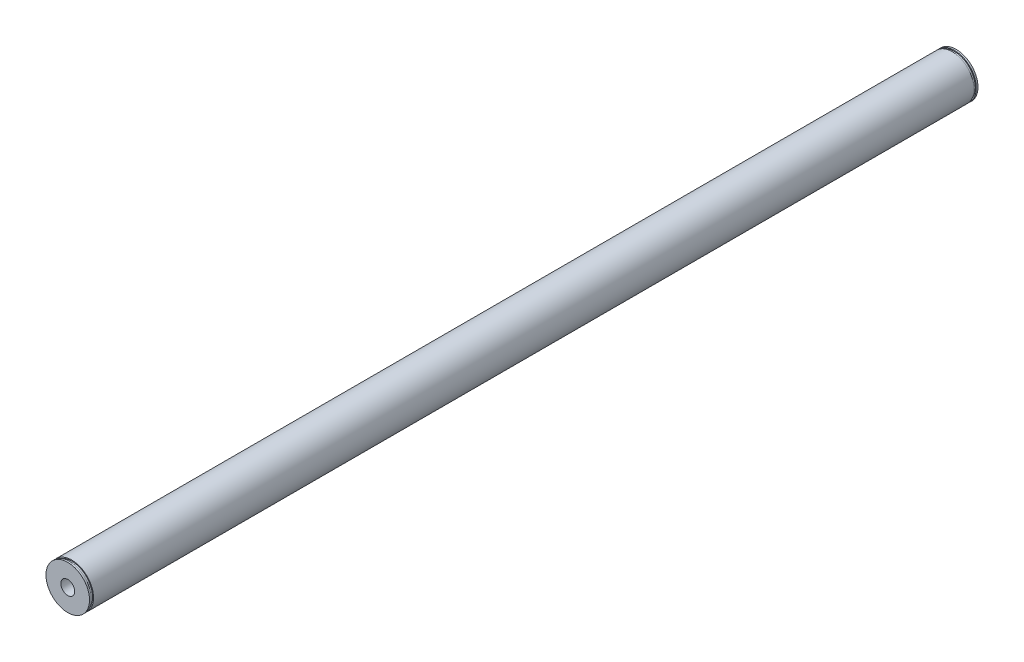
ISO-10303-21;
HEADER;
FILE_DESCRIPTION(('STEP AP214'),'2;1');
FILE_NAME('part.step','',(''),(''),'','','');
FILE_SCHEMA(('AUTOMOTIVE_DESIGN { 1 0 10303 214 1 1 1 1 }'));
ENDSEC;
DATA;
#1=APPLICATION_CONTEXT('core data for automotive mechanical design processes');
#2=APPLICATION_PROTOCOL_DEFINITION('international standard','automotive_design',2000,#1);
#3=PRODUCT_CONTEXT('',#1,'mechanical');
#4=PRODUCT('Part','Part','',(#3));
#5=PRODUCT_RELATED_PRODUCT_CATEGORY('part','',(#4));
#6=PRODUCT_DEFINITION_FORMATION('','',#4);
#7=PRODUCT_DEFINITION_CONTEXT('part definition',#1,'design');
#8=PRODUCT_DEFINITION('design','',#6,#7);
#9=PRODUCT_DEFINITION_SHAPE('','',#8);
#10=(LENGTH_UNIT() NAMED_UNIT(*) SI_UNIT(.MILLI.,.METRE.));
#11=(NAMED_UNIT(*) PLANE_ANGLE_UNIT() SI_UNIT($,.RADIAN.));
#12=(NAMED_UNIT(*) SI_UNIT($,.STERADIAN.) SOLID_ANGLE_UNIT());
#13=UNCERTAINTY_MEASURE_WITH_UNIT(LENGTH_MEASURE(1.E-05),#10,'distance_accuracy_value','');
#14=(GEOMETRIC_REPRESENTATION_CONTEXT(3) GLOBAL_UNCERTAINTY_ASSIGNED_CONTEXT((#13)) GLOBAL_UNIT_ASSIGNED_CONTEXT((#10,
#11,#12)) REPRESENTATION_CONTEXT('',''));
#15=CARTESIAN_POINT('',(0.,0.,0.));
#16=DIRECTION('',(0.,0.,1.));
#17=DIRECTION('',(1.,0.,0.));
#18=AXIS2_PLACEMENT_3D('',#15,#16,#17);
#19=CARTESIAN_POINT('',(0.,0.,510.));
#20=DIRECTION('',(0.,0.,-1.));
#21=DIRECTION('',(-1.,0.,0.));
#22=AXIS2_PLACEMENT_3D('',#19,#20,#21);
#23=CYLINDRICAL_SURFACE('',#22,12.5);
#24=CARTESIAN_POINT('',(0.,0.,507.7));
#25=DIRECTION('',(0.,0.,1.));
#26=DIRECTION('',(1.,0.,0.));
#27=AXIS2_PLACEMENT_3D('',#24,#25,#26);
#28=CIRCLE('',#27,12.5);
#29=CARTESIAN_POINT('',(12.5,0.,507.7));
#30=VERTEX_POINT('',#29);
#31=EDGE_CURVE('E60',#30,#30,#28,.T.);
#32=ORIENTED_EDGE('',*,*,#31,.F.);
#33=EDGE_LOOP('',(#32));
#34=FACE_BOUND('',#33,.T.);
#35=CARTESIAN_POINT('',(0.,0.,2.29999999999997));
#36=DIRECTION('',(0.,0.,1.));
#37=DIRECTION('',(1.,0.,0.));
#38=AXIS2_PLACEMENT_3D('',#35,#36,#37);
#39=CIRCLE('',#38,12.5000000000001);
#40=CARTESIAN_POINT('',(12.5000000000001,0.,2.29999999999997));
#41=VERTEX_POINT('',#40);
#42=EDGE_CURVE('E66',#41,#41,#39,.T.);
#43=ORIENTED_EDGE('',*,*,#42,.T.);
#44=EDGE_LOOP('',(#43));
#45=FACE_BOUND('',#44,.T.);
#46=ADVANCED_FACE('F30',(#34,#45),#23,.T.);
#47=CARTESIAN_POINT('',(0.,0.,510.));
#48=DIRECTION('',(0.,0.,1.));
#49=DIRECTION('',(1.,0.,0.));
#50=AXIS2_PLACEMENT_3D('',#47,#48,#49);
#51=CIRCLE('',#50,12.5);
#52=CARTESIAN_POINT('',(12.5,0.,510.));
#53=VERTEX_POINT('',#52);
#54=EDGE_CURVE('E10',#53,#53,#51,.T.);
#55=ORIENTED_EDGE('',*,*,#54,.F.);
#56=EDGE_LOOP('',(#55));
#57=FACE_BOUND('',#56,.T.);
#58=CARTESIAN_POINT('',(0.,0.,509.));
#59=DIRECTION('',(0.,0.,1.));
#60=DIRECTION('',(1.,0.,0.));
#61=AXIS2_PLACEMENT_3D('',#58,#59,#60);
#62=CIRCLE('',#61,12.5);
#63=CARTESIAN_POINT('',(12.5,0.,509.));
#64=VERTEX_POINT('',#63);
#65=EDGE_CURVE('E63',#64,#64,#62,.T.);
#66=ORIENTED_EDGE('',*,*,#65,.T.);
#67=EDGE_LOOP('',(#66));
#68=FACE_BOUND('',#67,.T.);
#69=ADVANCED_FACE('F32',(#57,#68),#23,.T.);
#70=CARTESIAN_POINT('',(0.,0.,510.));
#71=DIRECTION('',(0.,0.,1.));
#72=DIRECTION('',(1.,0.,0.));
#73=AXIS2_PLACEMENT_3D('',#70,#71,#72);
#74=PLANE('',#73);
#75=CARTESIAN_POINT('',(0.,0.,510.));
#76=DIRECTION('',(0.,0.,1.));
#77=DIRECTION('',(1.,0.,0.));
#78=AXIS2_PLACEMENT_3D('',#75,#76,#77);
#79=CIRCLE('',#78,4.);
#80=CARTESIAN_POINT('',(4.,0.,510.));
#81=VERTEX_POINT('',#80);
#82=EDGE_CURVE('E43',#81,#81,#79,.T.);
#83=ORIENTED_EDGE('',*,*,#82,.F.);
#84=EDGE_LOOP('',(#83));
#85=FACE_BOUND('',#84,.T.);
#86=ORIENTED_EDGE('',*,*,#54,.T.);
#87=EDGE_LOOP('',(#86));
#88=FACE_BOUND('',#87,.T.);
#89=ADVANCED_FACE('F92',(#85,#88),#74,.T.);
#90=CARTESIAN_POINT('',(0.,0.,480.));
#91=DIRECTION('',(0.,0.,1.));
#92=DIRECTION('',(1.,0.,0.));
#93=AXIS2_PLACEMENT_3D('',#90,#91,#92);
#94=CYLINDRICAL_SURFACE('',#93,4.);
#95=CARTESIAN_POINT('',(0.,0.,480.));
#96=DIRECTION('',(0.,0.,1.));
#97=DIRECTION('',(1.,0.,0.));
#98=AXIS2_PLACEMENT_3D('',#95,#96,#97);
#99=CIRCLE('',#98,4.);
#100=CARTESIAN_POINT('',(4.,0.,480.));
#101=VERTEX_POINT('',#100);
#102=EDGE_CURVE('E41',#101,#101,#99,.T.);
#103=ORIENTED_EDGE('',*,*,#102,.F.);
#104=EDGE_LOOP('',(#103));
#105=FACE_BOUND('',#104,.T.);
#106=ORIENTED_EDGE('',*,*,#82,.T.);
#107=EDGE_LOOP('',(#106));
#108=FACE_BOUND('',#107,.T.);
#109=ADVANCED_FACE('F136',(#105,#108),#94,.F.);
#110=CARTESIAN_POINT('',(0.,0.,480.));
#111=DIRECTION('',(0.,0.,1.));
#112=DIRECTION('',(1.,0.,0.));
#113=AXIS2_PLACEMENT_3D('',#110,#111,#112);
#114=PLANE('',#113);
#115=ORIENTED_EDGE('',*,*,#102,.T.);
#116=EDGE_LOOP('',(#115));
#117=FACE_BOUND('',#116,.T.);
#118=ADVANCED_FACE('F125',(#117),#114,.T.);
#119=CARTESIAN_POINT('',(0.,12.5,509.));
#120=DIRECTION('',(0.,0.,-1.));
#121=DIRECTION('',(-1.,0.,0.));
#122=AXIS2_PLACEMENT_3D('',#119,#120,#121);
#123=PLANE('',#122);
#124=CARTESIAN_POINT('',(0.,0.,509.));
#125=DIRECTION('',(0.,0.,1.));
#126=DIRECTION('',(1.,0.,0.));
#127=AXIS2_PLACEMENT_3D('',#124,#125,#126);
#128=CIRCLE('',#127,11.95);
#129=CARTESIAN_POINT('',(11.95,0.,509.));
#130=VERTEX_POINT('',#129);
#131=EDGE_CURVE('E52',#130,#130,#128,.T.);
#132=ORIENTED_EDGE('',*,*,#131,.T.);
#133=EDGE_LOOP('',(#132));
#134=FACE_BOUND('',#133,.T.);
#135=ORIENTED_EDGE('',*,*,#65,.F.);
#136=EDGE_LOOP('',(#135));
#137=FACE_BOUND('',#136,.T.);
#138=ADVANCED_FACE('F121',(#134,#137),#123,.T.);
#139=CARTESIAN_POINT('',(0.,0.,510.));
#140=DIRECTION('',(0.,0.,1.));
#141=DIRECTION('',(1.,0.,0.));
#142=AXIS2_PLACEMENT_3D('',#139,#140,#141);
#143=CYLINDRICAL_SURFACE('',#142,11.95);
#144=CARTESIAN_POINT('',(0.,0.,507.7));
#145=DIRECTION('',(0.,0.,1.));
#146=DIRECTION('',(1.,0.,0.));
#147=AXIS2_PLACEMENT_3D('',#144,#145,#146);
#148=CIRCLE('',#147,11.95);
#149=CARTESIAN_POINT('',(11.95,0.,507.7));
#150=VERTEX_POINT('',#149);
#151=EDGE_CURVE('E57',#150,#150,#148,.T.);
#152=ORIENTED_EDGE('',*,*,#151,.T.);
#153=EDGE_LOOP('',(#152));
#154=FACE_BOUND('',#153,.T.);
#155=ORIENTED_EDGE('',*,*,#131,.F.);
#156=EDGE_LOOP('',(#155));
#157=FACE_BOUND('',#156,.T.);
#158=ADVANCED_FACE('F114',(#154,#157),#143,.T.);
#159=CARTESIAN_POINT('',(0.,12.5,507.7));
#160=DIRECTION('',(0.,0.,1.));
#161=DIRECTION('',(1.,0.,0.));
#162=AXIS2_PLACEMENT_3D('',#159,#160,#161);
#163=PLANE('',#162);
#164=ORIENTED_EDGE('',*,*,#31,.T.);
#165=EDGE_LOOP('',(#164));
#166=FACE_BOUND('',#165,.T.);
#167=ORIENTED_EDGE('',*,*,#151,.F.);
#168=EDGE_LOOP('',(#167));
#169=FACE_BOUND('',#168,.T.);
#170=ADVANCED_FACE('F105',(#166,#169),#163,.T.);
#171=CARTESIAN_POINT('',(0.,12.5000000000001,2.29999999999997));
#172=DIRECTION('',(0.,0.,-1.));
#173=DIRECTION('',(-1.,0.,0.));
#174=AXIS2_PLACEMENT_3D('',#171,#172,#173);
#175=PLANE('',#174);
#176=CARTESIAN_POINT('',(0.,0.,2.29999999999997));
#177=DIRECTION('',(0.,0.,1.));
#178=DIRECTION('',(1.,0.,0.));
#179=AXIS2_PLACEMENT_3D('',#176,#177,#178);
#180=CIRCLE('',#179,11.9500000000001);
#181=CARTESIAN_POINT('',(11.9500000000001,0.,2.29999999999997));
#182=VERTEX_POINT('',#181);
#183=EDGE_CURVE('E69',#182,#182,#180,.T.);
#184=ORIENTED_EDGE('',*,*,#183,.T.);
#185=EDGE_LOOP('',(#184));
#186=FACE_BOUND('',#185,.T.);
#187=ORIENTED_EDGE('',*,*,#42,.F.);
#188=EDGE_LOOP('',(#187));
#189=FACE_BOUND('',#188,.T.);
#190=ADVANCED_FACE('F102',(#186,#189),#175,.T.);
#191=CARTESIAN_POINT('',(0.,0.,510.));
#192=DIRECTION('',(0.,0.,1.));
#193=DIRECTION('',(1.,0.,0.));
#194=AXIS2_PLACEMENT_3D('',#191,#192,#193);
#195=CYLINDRICAL_SURFACE('',#194,11.9500000000001);
#196=CARTESIAN_POINT('',(0.,0.,1.));
#197=DIRECTION('',(0.,0.,1.));
#198=DIRECTION('',(1.,0.,0.));
#199=AXIS2_PLACEMENT_3D('',#196,#197,#198);
#200=CIRCLE('',#199,11.9500000000001);
#201=CARTESIAN_POINT('',(11.9500000000001,0.,1.));
#202=VERTEX_POINT('',#201);
#203=EDGE_CURVE('E72',#202,#202,#200,.T.);
#204=ORIENTED_EDGE('',*,*,#203,.T.);
#205=EDGE_LOOP('',(#204));
#206=FACE_BOUND('',#205,.T.);
#207=ORIENTED_EDGE('',*,*,#183,.F.);
#208=EDGE_LOOP('',(#207));
#209=FACE_BOUND('',#208,.T.);
#210=ADVANCED_FACE('F104',(#206,#209),#195,.T.);
#211=CARTESIAN_POINT('',(0.,12.5000000000001,1.));
#212=DIRECTION('',(0.,0.,1.));
#213=DIRECTION('',(1.,0.,0.));
#214=AXIS2_PLACEMENT_3D('',#211,#212,#213);
#215=PLANE('',#214);
#216=CARTESIAN_POINT('',(0.,0.,1.));
#217=DIRECTION('',(0.,0.,1.));
#218=DIRECTION('',(1.,0.,0.));
#219=AXIS2_PLACEMENT_3D('',#216,#217,#218);
#220=CIRCLE('',#219,12.5000000000001);
#221=CARTESIAN_POINT('',(12.5000000000001,0.,1.));
#222=VERTEX_POINT('',#221);
#223=EDGE_CURVE('E75',#222,#222,#220,.T.);
#224=ORIENTED_EDGE('',*,*,#223,.T.);
#225=EDGE_LOOP('',(#224));
#226=FACE_BOUND('',#225,.T.);
#227=ORIENTED_EDGE('',*,*,#203,.F.);
#228=EDGE_LOOP('',(#227));
#229=FACE_BOUND('',#228,.T.);
#230=ADVANCED_FACE('F79',(#226,#229),#215,.T.);
#231=CARTESIAN_POINT('',(0.,0.,30.));
#232=DIRECTION('',(0.,0.,-1.));
#233=DIRECTION('',(-1.,0.,0.));
#234=AXIS2_PLACEMENT_3D('',#231,#232,#233);
#235=PLANE('',#234);
#236=CARTESIAN_POINT('',(0.,0.,30.));
#237=DIRECTION('',(0.,0.,-1.));
#238=DIRECTION('',(-1.,0.,0.));
#239=AXIS2_PLACEMENT_3D('',#236,#237,#238);
#240=CIRCLE('',#239,4.);
#241=CARTESIAN_POINT('',(-4.,0.,30.));
#242=VERTEX_POINT('',#241);
#243=EDGE_CURVE('E46',#242,#242,#240,.T.);
#244=ORIENTED_EDGE('',*,*,#243,.T.);
#245=EDGE_LOOP('',(#244));
#246=FACE_BOUND('',#245,.T.);
#247=ADVANCED_FACE('F127',(#246),#235,.T.);
#248=CARTESIAN_POINT('',(0.,0.,30.));
#249=DIRECTION('',(0.,0.,-1.));
#250=DIRECTION('',(-1.,0.,0.));
#251=AXIS2_PLACEMENT_3D('',#248,#249,#250);
#252=CYLINDRICAL_SURFACE('',#251,4.);
#253=ORIENTED_EDGE('',*,*,#243,.F.);
#254=EDGE_LOOP('',(#253));
#255=FACE_BOUND('',#254,.T.);
#256=CARTESIAN_POINT('',(0.,0.,0.));
#257=DIRECTION('',(0.,0.,-1.));
#258=DIRECTION('',(-1.,0.,0.));
#259=AXIS2_PLACEMENT_3D('',#256,#257,#258);
#260=CIRCLE('',#259,4.);
#261=CARTESIAN_POINT('',(-4.,0.,0.));
#262=VERTEX_POINT('',#261);
#263=EDGE_CURVE('E49',#262,#262,#260,.T.);
#264=ORIENTED_EDGE('',*,*,#263,.T.);
#265=EDGE_LOOP('',(#264));
#266=FACE_BOUND('',#265,.T.);
#267=ADVANCED_FACE('F89',(#255,#266),#252,.F.);
#268=CARTESIAN_POINT('',(0.,0.,0.));
#269=DIRECTION('',(0.,0.,1.));
#270=DIRECTION('',(1.,0.,0.));
#271=AXIS2_PLACEMENT_3D('',#268,#269,#270);
#272=PLANE('',#271);
#273=ORIENTED_EDGE('',*,*,#263,.F.);
#274=EDGE_LOOP('',(#273));
#275=FACE_BOUND('',#274,.T.);
#276=CARTESIAN_POINT('',(0.,0.,0.));
#277=DIRECTION('',(0.,0.,1.));
#278=DIRECTION('',(1.,0.,0.));
#279=AXIS2_PLACEMENT_3D('',#276,#277,#278);
#280=CIRCLE('',#279,12.5);
#281=CARTESIAN_POINT('',(12.5,0.,0.));
#282=VERTEX_POINT('',#281);
#283=EDGE_CURVE('E34',#282,#282,#280,.T.);
#284=ORIENTED_EDGE('',*,*,#283,.F.);
#285=EDGE_LOOP('',(#284));
#286=FACE_BOUND('',#285,.T.);
#287=ADVANCED_FACE('F84',(#275,#286),#272,.F.);
#288=ORIENTED_EDGE('',*,*,#283,.T.);
#289=EDGE_LOOP('',(#288));
#290=FACE_BOUND('',#289,.T.);
#291=ORIENTED_EDGE('',*,*,#223,.F.);
#292=EDGE_LOOP('',(#291));
#293=FACE_BOUND('',#292,.T.);
#294=ADVANCED_FACE('F82',(#290,#293),#23,.T.);
#295=CLOSED_SHELL('',(#46,#69,#89,#109,#118,#138,#158,#170,#190,#210,#230,#247,#267,#287,#294));
#296=MANIFOLD_SOLID_BREP('B2',#295);
#297=ADVANCED_BREP_SHAPE_REPRESENTATION('',(#18,#296),#14);
#298=SHAPE_DEFINITION_REPRESENTATION(#9,#297);
ENDSEC;
END-ISO-10303-21;
